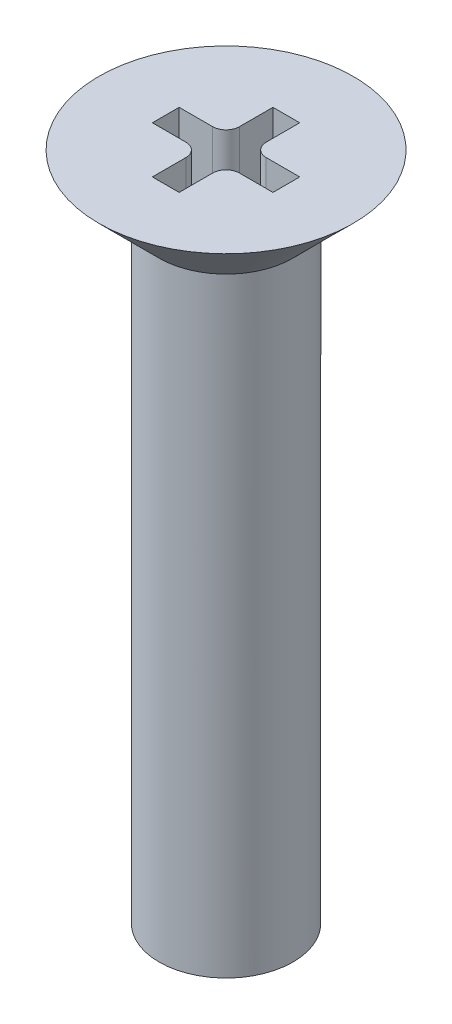
ISO-10303-21;
HEADER;
FILE_DESCRIPTION(('STEP AP214'),'2;1');
FILE_NAME('part.step','',(''),(''),'','','');
FILE_SCHEMA(('AUTOMOTIVE_DESIGN { 1 0 10303 214 1 1 1 1 }'));
ENDSEC;
DATA;
#1=APPLICATION_CONTEXT('core data for automotive mechanical design processes');
#2=APPLICATION_PROTOCOL_DEFINITION('international standard','automotive_design',2000,#1);
#3=PRODUCT_CONTEXT('',#1,'mechanical');
#4=PRODUCT('Part','Part','',(#3));
#5=PRODUCT_RELATED_PRODUCT_CATEGORY('part','',(#4));
#6=PRODUCT_DEFINITION_FORMATION('','',#4);
#7=PRODUCT_DEFINITION_CONTEXT('part definition',#1,'design');
#8=PRODUCT_DEFINITION('design','',#6,#7);
#9=PRODUCT_DEFINITION_SHAPE('','',#8);
#10=(LENGTH_UNIT() NAMED_UNIT(*) SI_UNIT(.MILLI.,.METRE.));
#11=(NAMED_UNIT(*) PLANE_ANGLE_UNIT() SI_UNIT($,.RADIAN.));
#12=(NAMED_UNIT(*) SI_UNIT($,.STERADIAN.) SOLID_ANGLE_UNIT());
#13=UNCERTAINTY_MEASURE_WITH_UNIT(LENGTH_MEASURE(1.E-05),#10,'distance_accuracy_value','');
#14=(GEOMETRIC_REPRESENTATION_CONTEXT(3) GLOBAL_UNCERTAINTY_ASSIGNED_CONTEXT((#13)) GLOBAL_UNIT_ASSIGNED_CONTEXT((#10,
#11,#12)) REPRESENTATION_CONTEXT('',''));
#15=CARTESIAN_POINT('',(0.,0.,0.));
#16=DIRECTION('',(0.,0.,1.));
#17=DIRECTION('',(1.,0.,0.));
#18=AXIS2_PLACEMENT_3D('',#15,#16,#17);
#19=CARTESIAN_POINT('',(0.,0.,0.));
#20=DIRECTION('',(0.,1.,0.));
#21=DIRECTION('',(0.,0.,1.));
#22=AXIS2_PLACEMENT_3D('',#19,#20,#21);
#23=PLANE('',#22);
#24=CARTESIAN_POINT('',(0.,0.,0.));
#25=DIRECTION('',(0.,1.,0.));
#26=DIRECTION('',(0.,0.,1.));
#27=AXIS2_PLACEMENT_3D('',#24,#25,#26);
#28=CIRCLE('',#27,1.9);
#29=CARTESIAN_POINT('',(0.,0.,1.9));
#30=VERTEX_POINT('',#29);
#31=EDGE_CURVE('E11',#30,#30,#28,.T.);
#32=ORIENTED_EDGE('',*,*,#31,.T.);
#33=EDGE_LOOP('',(#32));
#34=FACE_BOUND('',#33,.T.);
#35=DIRECTION('',(-1.,0.,0.));
#36=VECTOR('',#35,1.);
#37=CARTESIAN_POINT('',(0.4,0.,-0.2));
#38=LINE('',#37,#36);
#39=CARTESIAN_POINT('',(0.9,0.,-0.2));
#40=VERTEX_POINT('',#39);
#41=CARTESIAN_POINT('',(0.4,0.,-0.2));
#42=VERTEX_POINT('',#41);
#43=EDGE_CURVE('E47',#40,#42,#38,.T.);
#44=ORIENTED_EDGE('',*,*,#43,.F.);
#45=DIRECTION('',(0.,0.,-1.));
#46=VECTOR('',#45,1.);
#47=CARTESIAN_POINT('',(0.9,0.,0.2));
#48=LINE('',#47,#46);
#49=CARTESIAN_POINT('',(0.9,0.,0.2));
#50=VERTEX_POINT('',#49);
#51=EDGE_CURVE('E220',#50,#40,#48,.T.);
#52=ORIENTED_EDGE('',*,*,#51,.F.);
#53=DIRECTION('',(1.,0.,0.));
#54=VECTOR('',#53,1.);
#55=CARTESIAN_POINT('',(0.4,0.,0.2));
#56=LINE('',#55,#54);
#57=CARTESIAN_POINT('',(0.4,0.,0.2));
#58=VERTEX_POINT('',#57);
#59=EDGE_CURVE('E218',#58,#50,#56,.T.);
#60=ORIENTED_EDGE('',*,*,#59,.F.);
#61=CARTESIAN_POINT('',(0.4,0.,0.4));
#62=DIRECTION('',(0.,-1.,0.));
#63=DIRECTION('',(0.,0.,1.));
#64=AXIS2_PLACEMENT_3D('',#61,#62,#63);
#65=CIRCLE('',#64,0.2);
#66=CARTESIAN_POINT('',(0.2,0.,0.4));
#67=VERTEX_POINT('',#66);
#68=EDGE_CURVE('E155',#67,#58,#65,.T.);
#69=ORIENTED_EDGE('',*,*,#68,.F.);
#70=DIRECTION('',(0.,0.,-1.));
#71=VECTOR('',#70,1.);
#72=CARTESIAN_POINT('',(0.2,0.,0.9));
#73=LINE('',#72,#71);
#74=CARTESIAN_POINT('',(0.2,0.,0.9));
#75=VERTEX_POINT('',#74);
#76=EDGE_CURVE('E214',#75,#67,#73,.T.);
#77=ORIENTED_EDGE('',*,*,#76,.F.);
#78=DIRECTION('',(1.,0.,0.));
#79=VECTOR('',#78,1.);
#80=CARTESIAN_POINT('',(-0.2,0.,0.9));
#81=LINE('',#80,#79);
#82=CARTESIAN_POINT('',(-0.2,0.,0.9));
#83=VERTEX_POINT('',#82);
#84=EDGE_CURVE('E211',#83,#75,#81,.T.);
#85=ORIENTED_EDGE('',*,*,#84,.F.);
#86=DIRECTION('',(0.,0.,1.));
#87=VECTOR('',#86,1.);
#88=CARTESIAN_POINT('',(-0.2,0.,0.9));
#89=LINE('',#88,#87);
#90=CARTESIAN_POINT('',(-0.2,0.,0.4));
#91=VERTEX_POINT('',#90);
#92=EDGE_CURVE('E208',#91,#83,#89,.T.);
#93=ORIENTED_EDGE('',*,*,#92,.F.);
#94=CARTESIAN_POINT('',(-0.4,0.,0.4));
#95=DIRECTION('',(0.,-1.,0.));
#96=DIRECTION('',(0.,0.,1.));
#97=AXIS2_PLACEMENT_3D('',#94,#95,#96);
#98=CIRCLE('',#97,0.2);
#99=CARTESIAN_POINT('',(-0.4,0.,0.2));
#100=VERTEX_POINT('',#99);
#101=EDGE_CURVE('E205',#100,#91,#98,.T.);
#102=ORIENTED_EDGE('',*,*,#101,.F.);
#103=DIRECTION('',(1.,0.,0.));
#104=VECTOR('',#103,1.);
#105=CARTESIAN_POINT('',(-0.9,0.,0.2));
#106=LINE('',#105,#104);
#107=CARTESIAN_POINT('',(-0.9,0.,0.2));
#108=VERTEX_POINT('',#107);
#109=EDGE_CURVE('E202',#108,#100,#106,.T.);
#110=ORIENTED_EDGE('',*,*,#109,.F.);
#111=DIRECTION('',(0.,0.,1.));
#112=VECTOR('',#111,1.);
#113=CARTESIAN_POINT('',(-0.9,0.,0.2));
#114=LINE('',#113,#112);
#115=CARTESIAN_POINT('',(-0.9,0.,-0.2));
#116=VERTEX_POINT('',#115);
#117=EDGE_CURVE('E199',#116,#108,#114,.T.);
#118=ORIENTED_EDGE('',*,*,#117,.F.);
#119=DIRECTION('',(-1.,0.,0.));
#120=VECTOR('',#119,1.);
#121=CARTESIAN_POINT('',(-0.9,0.,-0.2));
#122=LINE('',#121,#120);
#123=CARTESIAN_POINT('',(-0.4,0.,-0.2));
#124=VERTEX_POINT('',#123);
#125=EDGE_CURVE('E196',#124,#116,#122,.T.);
#126=ORIENTED_EDGE('',*,*,#125,.F.);
#127=CARTESIAN_POINT('',(-0.4,0.,-0.4));
#128=DIRECTION('',(0.,-1.,0.));
#129=DIRECTION('',(0.,0.,1.));
#130=AXIS2_PLACEMENT_3D('',#127,#128,#129);
#131=CIRCLE('',#130,0.2);
#132=CARTESIAN_POINT('',(-0.2,0.,-0.4));
#133=VERTEX_POINT('',#132);
#134=EDGE_CURVE('E193',#133,#124,#131,.T.);
#135=ORIENTED_EDGE('',*,*,#134,.F.);
#136=DIRECTION('',(0.,0.,1.));
#137=VECTOR('',#136,1.);
#138=CARTESIAN_POINT('',(-0.2,0.,-0.4));
#139=LINE('',#138,#137);
#140=CARTESIAN_POINT('',(-0.2,0.,-0.9));
#141=VERTEX_POINT('',#140);
#142=EDGE_CURVE('E190',#141,#133,#139,.T.);
#143=ORIENTED_EDGE('',*,*,#142,.F.);
#144=DIRECTION('',(-1.,0.,0.));
#145=VECTOR('',#144,1.);
#146=CARTESIAN_POINT('',(-0.2,0.,-0.9));
#147=LINE('',#146,#145);
#148=CARTESIAN_POINT('',(0.2,0.,-0.9));
#149=VERTEX_POINT('',#148);
#150=EDGE_CURVE('E187',#149,#141,#147,.T.);
#151=ORIENTED_EDGE('',*,*,#150,.F.);
#152=DIRECTION('',(0.,0.,-1.));
#153=VECTOR('',#152,1.);
#154=CARTESIAN_POINT('',(0.2,0.,-0.4));
#155=LINE('',#154,#153);
#156=CARTESIAN_POINT('',(0.2,0.,-0.4));
#157=VERTEX_POINT('',#156);
#158=EDGE_CURVE('E184',#157,#149,#155,.T.);
#159=ORIENTED_EDGE('',*,*,#158,.F.);
#160=CARTESIAN_POINT('',(0.4,0.,-0.4));
#161=DIRECTION('',(0.,-1.,0.));
#162=DIRECTION('',(0.,0.,1.));
#163=AXIS2_PLACEMENT_3D('',#160,#161,#162);
#164=CIRCLE('',#163,0.2);
#165=EDGE_CURVE('E181',#42,#157,#164,.T.);
#166=ORIENTED_EDGE('',*,*,#165,.F.);
#167=EDGE_LOOP('',(#44,#52,#60,#69,#77,#85,#93,#102,#110,#118,#126,#135,#143,#151,#159,#166));
#168=FACE_BOUND('',#167,.T.);
#169=ADVANCED_FACE('F33',(#34,#168),#23,.T.);
#170=CARTESIAN_POINT('',(0.,0.,0.));
#171=DIRECTION('',(0.,1.,0.));
#172=DIRECTION('',(0.,0.,1.));
#173=AXIS2_PLACEMENT_3D('',#170,#171,#172);
#174=CONICAL_SURFACE('',#173,1.9,0.785398163397447);
#175=CARTESIAN_POINT('',(0.,-0.900000000000003,0.));
#176=DIRECTION('',(0.,1.,0.));
#177=DIRECTION('',(0.,0.,1.));
#178=AXIS2_PLACEMENT_3D('',#175,#176,#177);
#179=CIRCLE('',#178,1.);
#180=CARTESIAN_POINT('',(0.,-0.900000000000003,1.));
#181=VERTEX_POINT('',#180);
#182=EDGE_CURVE('E40',#181,#181,#179,.T.);
#183=ORIENTED_EDGE('',*,*,#182,.T.);
#184=EDGE_LOOP('',(#183));
#185=FACE_BOUND('',#184,.T.);
#186=ORIENTED_EDGE('',*,*,#31,.F.);
#187=EDGE_LOOP('',(#186));
#188=FACE_BOUND('',#187,.T.);
#189=ADVANCED_FACE('F254',(#185,#188),#174,.T.);
#190=CARTESIAN_POINT('',(0.,0.872326938896606,0.));
#191=DIRECTION('',(0.,1.,0.));
#192=DIRECTION('',(0.,0.,1.));
#193=AXIS2_PLACEMENT_3D('',#190,#191,#192);
#194=CYLINDRICAL_SURFACE('',#193,1.);
#195=ORIENTED_EDGE('',*,*,#182,.F.);
#196=EDGE_LOOP('',(#195));
#197=FACE_BOUND('',#196,.T.);
#198=CARTESIAN_POINT('',(0.,-10.,0.));
#199=DIRECTION('',(0.,-1.,0.));
#200=DIRECTION('',(0.,0.,-1.));
#201=AXIS2_PLACEMENT_3D('',#198,#199,#200);
#202=CIRCLE('',#201,1.);
#203=CARTESIAN_POINT('',(0.,-10.,-1.));
#204=VERTEX_POINT('',#203);
#205=EDGE_CURVE('E224',#204,#204,#202,.T.);
#206=ORIENTED_EDGE('',*,*,#205,.F.);
#207=EDGE_LOOP('',(#206));
#208=FACE_BOUND('',#207,.T.);
#209=ADVANCED_FACE('F257',(#197,#208),#194,.T.);
#210=CARTESIAN_POINT('',(0.,-10.,0.));
#211=DIRECTION('',(0.,-1.,0.));
#212=DIRECTION('',(0.,0.,-1.));
#213=AXIS2_PLACEMENT_3D('',#210,#211,#212);
#214=PLANE('',#213);
#215=ORIENTED_EDGE('',*,*,#205,.T.);
#216=EDGE_LOOP('',(#215));
#217=FACE_BOUND('',#216,.T.);
#218=ADVANCED_FACE('F260',(#217),#214,.T.);
#219=CARTESIAN_POINT('',(0.4,-1.,-0.2));
#220=DIRECTION('',(0.,0.,-1.));
#221=DIRECTION('',(-1.,0.,0.));
#222=AXIS2_PLACEMENT_3D('',#219,#220,#221);
#223=PLANE('',#222);
#224=ORIENTED_EDGE('',*,*,#43,.T.);
#225=DIRECTION('',(0.,1.,0.));
#226=VECTOR('',#225,1.);
#227=CARTESIAN_POINT('',(0.4,-1.,-0.2));
#228=LINE('',#227,#226);
#229=CARTESIAN_POINT('',(0.4,-1.,-0.2));
#230=VERTEX_POINT('',#229);
#231=EDGE_CURVE('E107',#230,#42,#228,.T.);
#232=ORIENTED_EDGE('',*,*,#231,.F.);
#233=DIRECTION('',(-1.,0.,0.));
#234=VECTOR('',#233,1.);
#235=CARTESIAN_POINT('',(0.4,-1.,-0.2));
#236=LINE('',#235,#234);
#237=CARTESIAN_POINT('',(0.9,-1.,-0.2));
#238=VERTEX_POINT('',#237);
#239=EDGE_CURVE('E222',#238,#230,#236,.T.);
#240=ORIENTED_EDGE('',*,*,#239,.F.);
#241=DIRECTION('',(0.,1.,0.));
#242=VECTOR('',#241,1.);
#243=CARTESIAN_POINT('',(0.9,-1.,-0.2));
#244=LINE('',#243,#242);
#245=EDGE_CURVE('E55',#238,#40,#244,.T.);
#246=ORIENTED_EDGE('',*,*,#245,.T.);
#247=EDGE_LOOP('',(#224,#232,#240,#246));
#248=FACE_BOUND('',#247,.T.);
#249=ADVANCED_FACE('F265',(#248),#223,.F.);
#250=CARTESIAN_POINT('',(0.9,-1.,0.2));
#251=DIRECTION('',(1.,0.,0.));
#252=DIRECTION('',(0.,0.,-1.));
#253=AXIS2_PLACEMENT_3D('',#250,#251,#252);
#254=PLANE('',#253);
#255=ORIENTED_EDGE('',*,*,#51,.T.);
#256=ORIENTED_EDGE('',*,*,#245,.F.);
#257=DIRECTION('',(0.,0.,-1.));
#258=VECTOR('',#257,1.);
#259=CARTESIAN_POINT('',(0.9,-1.,0.2));
#260=LINE('',#259,#258);
#261=CARTESIAN_POINT('',(0.9,-1.,0.2));
#262=VERTEX_POINT('',#261);
#263=EDGE_CURVE('E167',#262,#238,#260,.T.);
#264=ORIENTED_EDGE('',*,*,#263,.F.);
#265=DIRECTION('',(0.,1.,0.));
#266=VECTOR('',#265,1.);
#267=CARTESIAN_POINT('',(0.9,-1.,0.2));
#268=LINE('',#267,#266);
#269=EDGE_CURVE('E159',#262,#50,#268,.T.);
#270=ORIENTED_EDGE('',*,*,#269,.T.);
#271=EDGE_LOOP('',(#255,#256,#264,#270));
#272=FACE_BOUND('',#271,.T.);
#273=ADVANCED_FACE('F270',(#272),#254,.F.);
#274=CARTESIAN_POINT('',(0.4,-1.,0.2));
#275=DIRECTION('',(0.,0.,1.));
#276=DIRECTION('',(1.,0.,0.));
#277=AXIS2_PLACEMENT_3D('',#274,#275,#276);
#278=PLANE('',#277);
#279=ORIENTED_EDGE('',*,*,#59,.T.);
#280=ORIENTED_EDGE('',*,*,#269,.F.);
#281=DIRECTION('',(1.,0.,0.));
#282=VECTOR('',#281,1.);
#283=CARTESIAN_POINT('',(0.4,-1.,0.2));
#284=LINE('',#283,#282);
#285=CARTESIAN_POINT('',(0.4,-1.,0.2));
#286=VERTEX_POINT('',#285);
#287=EDGE_CURVE('E163',#286,#262,#284,.T.);
#288=ORIENTED_EDGE('',*,*,#287,.F.);
#289=DIRECTION('',(0.,1.,0.));
#290=VECTOR('',#289,1.);
#291=CARTESIAN_POINT('',(0.4,-1.,0.2));
#292=LINE('',#291,#290);
#293=EDGE_CURVE('E148',#286,#58,#292,.T.);
#294=ORIENTED_EDGE('',*,*,#293,.T.);
#295=EDGE_LOOP('',(#279,#280,#288,#294));
#296=FACE_BOUND('',#295,.T.);
#297=ADVANCED_FACE('F164',(#296),#278,.F.);
#298=CARTESIAN_POINT('',(0.4,-1.,0.4));
#299=DIRECTION('',(0.,1.,0.));
#300=DIRECTION('',(0.,0.,1.));
#301=AXIS2_PLACEMENT_3D('',#298,#299,#300);
#302=CYLINDRICAL_SURFACE('',#301,0.2);
#303=ORIENTED_EDGE('',*,*,#68,.T.);
#304=ORIENTED_EDGE('',*,*,#293,.F.);
#305=CARTESIAN_POINT('',(0.4,-1.,0.4));
#306=DIRECTION('',(0.,-1.,0.));
#307=DIRECTION('',(0.,0.,1.));
#308=AXIS2_PLACEMENT_3D('',#305,#306,#307);
#309=CIRCLE('',#308,0.2);
#310=CARTESIAN_POINT('',(0.2,-1.,0.4));
#311=VERTEX_POINT('',#310);
#312=EDGE_CURVE('E152',#311,#286,#309,.T.);
#313=ORIENTED_EDGE('',*,*,#312,.F.);
#314=DIRECTION('',(0.,1.,0.));
#315=VECTOR('',#314,1.);
#316=CARTESIAN_POINT('',(0.2,-1.,0.4));
#317=LINE('',#316,#315);
#318=EDGE_CURVE('E160',#311,#67,#317,.T.);
#319=ORIENTED_EDGE('',*,*,#318,.T.);
#320=EDGE_LOOP('',(#303,#304,#313,#319));
#321=FACE_BOUND('',#320,.T.);
#322=ADVANCED_FACE('F150',(#321),#302,.T.);
#323=CARTESIAN_POINT('',(0.2,-1.,0.9));
#324=DIRECTION('',(1.,0.,0.));
#325=DIRECTION('',(0.,0.,-1.));
#326=AXIS2_PLACEMENT_3D('',#323,#324,#325);
#327=PLANE('',#326);
#328=ORIENTED_EDGE('',*,*,#76,.T.);
#329=ORIENTED_EDGE('',*,*,#318,.F.);
#330=DIRECTION('',(0.,0.,-1.));
#331=VECTOR('',#330,1.);
#332=CARTESIAN_POINT('',(0.2,-1.,0.9));
#333=LINE('',#332,#331);
#334=CARTESIAN_POINT('',(0.2,-1.,0.9));
#335=VERTEX_POINT('',#334);
#336=EDGE_CURVE('E173',#335,#311,#333,.T.);
#337=ORIENTED_EDGE('',*,*,#336,.F.);
#338=DIRECTION('',(0.,1.,0.));
#339=VECTOR('',#338,1.);
#340=CARTESIAN_POINT('',(0.2,-1.,0.9));
#341=LINE('',#340,#339);
#342=EDGE_CURVE('E227',#335,#75,#341,.T.);
#343=ORIENTED_EDGE('',*,*,#342,.T.);
#344=EDGE_LOOP('',(#328,#329,#337,#343));
#345=FACE_BOUND('',#344,.T.);
#346=ADVANCED_FACE('F324',(#345),#327,.F.);
#347=CARTESIAN_POINT('',(-0.2,-1.,0.9));
#348=DIRECTION('',(0.,0.,1.));
#349=DIRECTION('',(1.,0.,0.));
#350=AXIS2_PLACEMENT_3D('',#347,#348,#349);
#351=PLANE('',#350);
#352=ORIENTED_EDGE('',*,*,#84,.T.);
#353=ORIENTED_EDGE('',*,*,#342,.F.);
#354=DIRECTION('',(1.,0.,0.));
#355=VECTOR('',#354,1.);
#356=CARTESIAN_POINT('',(-0.2,-1.,0.9));
#357=LINE('',#356,#355);
#358=CARTESIAN_POINT('',(-0.2,-1.,0.9));
#359=VERTEX_POINT('',#358);
#360=EDGE_CURVE('E175',#359,#335,#357,.T.);
#361=ORIENTED_EDGE('',*,*,#360,.F.);
#362=DIRECTION('',(0.,1.,0.));
#363=VECTOR('',#362,1.);
#364=CARTESIAN_POINT('',(-0.2,-1.,0.9));
#365=LINE('',#364,#363);
#366=EDGE_CURVE('E229',#359,#83,#365,.T.);
#367=ORIENTED_EDGE('',*,*,#366,.T.);
#368=EDGE_LOOP('',(#352,#353,#361,#367));
#369=FACE_BOUND('',#368,.T.);
#370=ADVANCED_FACE('F320',(#369),#351,.F.);
#371=CARTESIAN_POINT('',(-0.2,-1.,0.9));
#372=DIRECTION('',(-1.,0.,0.));
#373=DIRECTION('',(0.,0.,1.));
#374=AXIS2_PLACEMENT_3D('',#371,#372,#373);
#375=PLANE('',#374);
#376=ORIENTED_EDGE('',*,*,#92,.T.);
#377=ORIENTED_EDGE('',*,*,#366,.F.);
#378=DIRECTION('',(0.,0.,1.));
#379=VECTOR('',#378,1.);
#380=CARTESIAN_POINT('',(-0.2,-1.,0.9));
#381=LINE('',#380,#379);
#382=CARTESIAN_POINT('',(-0.2,-1.,0.4));
#383=VERTEX_POINT('',#382);
#384=EDGE_CURVE('E315',#383,#359,#381,.T.);
#385=ORIENTED_EDGE('',*,*,#384,.F.);
#386=DIRECTION('',(0.,1.,0.));
#387=VECTOR('',#386,1.);
#388=CARTESIAN_POINT('',(-0.2,-1.,0.4));
#389=LINE('',#388,#387);
#390=EDGE_CURVE('E231',#383,#91,#389,.T.);
#391=ORIENTED_EDGE('',*,*,#390,.T.);
#392=EDGE_LOOP('',(#376,#377,#385,#391));
#393=FACE_BOUND('',#392,.T.);
#394=ADVANCED_FACE('F329',(#393),#375,.F.);
#395=CARTESIAN_POINT('',(-0.4,-1.,0.4));
#396=DIRECTION('',(0.,1.,0.));
#397=DIRECTION('',(0.,0.,1.));
#398=AXIS2_PLACEMENT_3D('',#395,#396,#397);
#399=CYLINDRICAL_SURFACE('',#398,0.2);
#400=ORIENTED_EDGE('',*,*,#101,.T.);
#401=ORIENTED_EDGE('',*,*,#390,.F.);
#402=CARTESIAN_POINT('',(-0.4,-1.,0.4));
#403=DIRECTION('',(0.,-1.,0.));
#404=DIRECTION('',(0.,0.,1.));
#405=AXIS2_PLACEMENT_3D('',#402,#403,#404);
#406=CIRCLE('',#405,0.2);
#407=CARTESIAN_POINT('',(-0.4,-1.,0.2));
#408=VERTEX_POINT('',#407);
#409=EDGE_CURVE('E312',#408,#383,#406,.T.);
#410=ORIENTED_EDGE('',*,*,#409,.F.);
#411=DIRECTION('',(0.,1.,0.));
#412=VECTOR('',#411,1.);
#413=CARTESIAN_POINT('',(-0.4,-1.,0.2));
#414=LINE('',#413,#412);
#415=EDGE_CURVE('E233',#408,#100,#414,.T.);
#416=ORIENTED_EDGE('',*,*,#415,.T.);
#417=EDGE_LOOP('',(#400,#401,#410,#416));
#418=FACE_BOUND('',#417,.T.);
#419=ADVANCED_FACE('F332',(#418),#399,.T.);
#420=CARTESIAN_POINT('',(-0.9,-1.,0.2));
#421=DIRECTION('',(0.,0.,1.));
#422=DIRECTION('',(1.,0.,0.));
#423=AXIS2_PLACEMENT_3D('',#420,#421,#422);
#424=PLANE('',#423);
#425=ORIENTED_EDGE('',*,*,#109,.T.);
#426=ORIENTED_EDGE('',*,*,#415,.F.);
#427=DIRECTION('',(1.,0.,0.));
#428=VECTOR('',#427,1.);
#429=CARTESIAN_POINT('',(-0.9,-1.,0.2));
#430=LINE('',#429,#428);
#431=CARTESIAN_POINT('',(-0.9,-1.,0.2));
#432=VERTEX_POINT('',#431);
#433=EDGE_CURVE('E309',#432,#408,#430,.T.);
#434=ORIENTED_EDGE('',*,*,#433,.F.);
#435=DIRECTION('',(0.,1.,0.));
#436=VECTOR('',#435,1.);
#437=CARTESIAN_POINT('',(-0.9,-1.,0.2));
#438=LINE('',#437,#436);
#439=EDGE_CURVE('E235',#432,#108,#438,.T.);
#440=ORIENTED_EDGE('',*,*,#439,.T.);
#441=EDGE_LOOP('',(#425,#426,#434,#440));
#442=FACE_BOUND('',#441,.T.);
#443=ADVANCED_FACE('F335',(#442),#424,.F.);
#444=CARTESIAN_POINT('',(-0.9,-1.,0.2));
#445=DIRECTION('',(-1.,0.,0.));
#446=DIRECTION('',(0.,0.,1.));
#447=AXIS2_PLACEMENT_3D('',#444,#445,#446);
#448=PLANE('',#447);
#449=ORIENTED_EDGE('',*,*,#117,.T.);
#450=ORIENTED_EDGE('',*,*,#439,.F.);
#451=DIRECTION('',(0.,0.,1.));
#452=VECTOR('',#451,1.);
#453=CARTESIAN_POINT('',(-0.9,-1.,0.2));
#454=LINE('',#453,#452);
#455=CARTESIAN_POINT('',(-0.9,-1.,-0.2));
#456=VERTEX_POINT('',#455);
#457=EDGE_CURVE('E306',#456,#432,#454,.T.);
#458=ORIENTED_EDGE('',*,*,#457,.F.);
#459=DIRECTION('',(0.,1.,0.));
#460=VECTOR('',#459,1.);
#461=CARTESIAN_POINT('',(-0.9,-1.,-0.2));
#462=LINE('',#461,#460);
#463=EDGE_CURVE('E237',#456,#116,#462,.T.);
#464=ORIENTED_EDGE('',*,*,#463,.T.);
#465=EDGE_LOOP('',(#449,#450,#458,#464));
#466=FACE_BOUND('',#465,.T.);
#467=ADVANCED_FACE('F340',(#466),#448,.F.);
#468=CARTESIAN_POINT('',(-0.9,-1.,-0.2));
#469=DIRECTION('',(0.,0.,-1.));
#470=DIRECTION('',(-1.,0.,0.));
#471=AXIS2_PLACEMENT_3D('',#468,#469,#470);
#472=PLANE('',#471);
#473=ORIENTED_EDGE('',*,*,#125,.T.);
#474=ORIENTED_EDGE('',*,*,#463,.F.);
#475=DIRECTION('',(-1.,0.,0.));
#476=VECTOR('',#475,1.);
#477=CARTESIAN_POINT('',(-0.9,-1.,-0.2));
#478=LINE('',#477,#476);
#479=CARTESIAN_POINT('',(-0.4,-1.,-0.2));
#480=VERTEX_POINT('',#479);
#481=EDGE_CURVE('E303',#480,#456,#478,.T.);
#482=ORIENTED_EDGE('',*,*,#481,.F.);
#483=DIRECTION('',(0.,1.,0.));
#484=VECTOR('',#483,1.);
#485=CARTESIAN_POINT('',(-0.4,-1.,-0.2));
#486=LINE('',#485,#484);
#487=EDGE_CURVE('E239',#480,#124,#486,.T.);
#488=ORIENTED_EDGE('',*,*,#487,.T.);
#489=EDGE_LOOP('',(#473,#474,#482,#488));
#490=FACE_BOUND('',#489,.T.);
#491=ADVANCED_FACE('F344',(#490),#472,.F.);
#492=CARTESIAN_POINT('',(-0.4,-1.,-0.4));
#493=DIRECTION('',(0.,1.,0.));
#494=DIRECTION('',(0.,0.,1.));
#495=AXIS2_PLACEMENT_3D('',#492,#493,#494);
#496=CYLINDRICAL_SURFACE('',#495,0.2);
#497=ORIENTED_EDGE('',*,*,#134,.T.);
#498=ORIENTED_EDGE('',*,*,#487,.F.);
#499=CARTESIAN_POINT('',(-0.4,-1.,-0.4));
#500=DIRECTION('',(0.,-1.,0.));
#501=DIRECTION('',(0.,0.,1.));
#502=AXIS2_PLACEMENT_3D('',#499,#500,#501);
#503=CIRCLE('',#502,0.2);
#504=CARTESIAN_POINT('',(-0.2,-1.,-0.4));
#505=VERTEX_POINT('',#504);
#506=EDGE_CURVE('E300',#505,#480,#503,.T.);
#507=ORIENTED_EDGE('',*,*,#506,.F.);
#508=DIRECTION('',(0.,1.,0.));
#509=VECTOR('',#508,1.);
#510=CARTESIAN_POINT('',(-0.2,-1.,-0.4));
#511=LINE('',#510,#509);
#512=EDGE_CURVE('E241',#505,#133,#511,.T.);
#513=ORIENTED_EDGE('',*,*,#512,.T.);
#514=EDGE_LOOP('',(#497,#498,#507,#513));
#515=FACE_BOUND('',#514,.T.);
#516=ADVANCED_FACE('F347',(#515),#496,.T.);
#517=CARTESIAN_POINT('',(-0.2,-1.,-0.4));
#518=DIRECTION('',(-1.,0.,0.));
#519=DIRECTION('',(0.,0.,1.));
#520=AXIS2_PLACEMENT_3D('',#517,#518,#519);
#521=PLANE('',#520);
#522=ORIENTED_EDGE('',*,*,#142,.T.);
#523=ORIENTED_EDGE('',*,*,#512,.F.);
#524=DIRECTION('',(0.,0.,1.));
#525=VECTOR('',#524,1.);
#526=CARTESIAN_POINT('',(-0.2,-1.,-0.4));
#527=LINE('',#526,#525);
#528=CARTESIAN_POINT('',(-0.2,-1.,-0.9));
#529=VERTEX_POINT('',#528);
#530=EDGE_CURVE('E297',#529,#505,#527,.T.);
#531=ORIENTED_EDGE('',*,*,#530,.F.);
#532=DIRECTION('',(0.,1.,0.));
#533=VECTOR('',#532,1.);
#534=CARTESIAN_POINT('',(-0.2,-1.,-0.9));
#535=LINE('',#534,#533);
#536=EDGE_CURVE('E243',#529,#141,#535,.T.);
#537=ORIENTED_EDGE('',*,*,#536,.T.);
#538=EDGE_LOOP('',(#522,#523,#531,#537));
#539=FACE_BOUND('',#538,.T.);
#540=ADVANCED_FACE('F350',(#539),#521,.F.);
#541=CARTESIAN_POINT('',(-0.2,-1.,-0.9));
#542=DIRECTION('',(0.,0.,-1.));
#543=DIRECTION('',(-1.,0.,0.));
#544=AXIS2_PLACEMENT_3D('',#541,#542,#543);
#545=PLANE('',#544);
#546=ORIENTED_EDGE('',*,*,#150,.T.);
#547=ORIENTED_EDGE('',*,*,#536,.F.);
#548=DIRECTION('',(-1.,0.,0.));
#549=VECTOR('',#548,1.);
#550=CARTESIAN_POINT('',(-0.2,-1.,-0.9));
#551=LINE('',#550,#549);
#552=CARTESIAN_POINT('',(0.2,-1.,-0.9));
#553=VERTEX_POINT('',#552);
#554=EDGE_CURVE('E294',#553,#529,#551,.T.);
#555=ORIENTED_EDGE('',*,*,#554,.F.);
#556=DIRECTION('',(0.,1.,0.));
#557=VECTOR('',#556,1.);
#558=CARTESIAN_POINT('',(0.2,-1.,-0.9));
#559=LINE('',#558,#557);
#560=EDGE_CURVE('E245',#553,#149,#559,.T.);
#561=ORIENTED_EDGE('',*,*,#560,.T.);
#562=EDGE_LOOP('',(#546,#547,#555,#561));
#563=FACE_BOUND('',#562,.T.);
#564=ADVANCED_FACE('F354',(#563),#545,.F.);
#565=CARTESIAN_POINT('',(0.2,-1.,-0.4));
#566=DIRECTION('',(1.,0.,0.));
#567=DIRECTION('',(0.,0.,-1.));
#568=AXIS2_PLACEMENT_3D('',#565,#566,#567);
#569=PLANE('',#568);
#570=ORIENTED_EDGE('',*,*,#158,.T.);
#571=ORIENTED_EDGE('',*,*,#560,.F.);
#572=DIRECTION('',(0.,0.,-1.));
#573=VECTOR('',#572,1.);
#574=CARTESIAN_POINT('',(0.2,-1.,-0.4));
#575=LINE('',#574,#573);
#576=CARTESIAN_POINT('',(0.2,-1.,-0.4));
#577=VERTEX_POINT('',#576);
#578=EDGE_CURVE('E289',#577,#553,#575,.T.);
#579=ORIENTED_EDGE('',*,*,#578,.F.);
#580=DIRECTION('',(0.,1.,0.));
#581=VECTOR('',#580,1.);
#582=CARTESIAN_POINT('',(0.2,-1.,-0.4));
#583=LINE('',#582,#581);
#584=EDGE_CURVE('E247',#577,#157,#583,.T.);
#585=ORIENTED_EDGE('',*,*,#584,.T.);
#586=EDGE_LOOP('',(#570,#571,#579,#585));
#587=FACE_BOUND('',#586,.T.);
#588=ADVANCED_FACE('F356',(#587),#569,.F.);
#589=CARTESIAN_POINT('',(0.4,-1.,-0.4));
#590=DIRECTION('',(0.,1.,0.));
#591=DIRECTION('',(0.,0.,1.));
#592=AXIS2_PLACEMENT_3D('',#589,#590,#591);
#593=CYLINDRICAL_SURFACE('',#592,0.2);
#594=ORIENTED_EDGE('',*,*,#165,.T.);
#595=ORIENTED_EDGE('',*,*,#584,.F.);
#596=CARTESIAN_POINT('',(0.4,-1.,-0.4));
#597=DIRECTION('',(0.,-1.,0.));
#598=DIRECTION('',(0.,0.,1.));
#599=AXIS2_PLACEMENT_3D('',#596,#597,#598);
#600=CIRCLE('',#599,0.2);
#601=EDGE_CURVE('E287',#230,#577,#600,.T.);
#602=ORIENTED_EDGE('',*,*,#601,.F.);
#603=ORIENTED_EDGE('',*,*,#231,.T.);
#604=EDGE_LOOP('',(#594,#595,#602,#603));
#605=FACE_BOUND('',#604,.T.);
#606=ADVANCED_FACE('F284',(#605),#593,.T.);
#607=CARTESIAN_POINT('',(0.4,-1.,0.4));
#608=DIRECTION('',(0.,1.,0.));
#609=DIRECTION('',(0.,0.,1.));
#610=AXIS2_PLACEMENT_3D('',#607,#608,#609);
#611=PLANE('',#610);
#612=ORIENTED_EDGE('',*,*,#239,.T.);
#613=ORIENTED_EDGE('',*,*,#601,.T.);
#614=ORIENTED_EDGE('',*,*,#578,.T.);
#615=ORIENTED_EDGE('',*,*,#554,.T.);
#616=ORIENTED_EDGE('',*,*,#530,.T.);
#617=ORIENTED_EDGE('',*,*,#506,.T.);
#618=ORIENTED_EDGE('',*,*,#481,.T.);
#619=ORIENTED_EDGE('',*,*,#457,.T.);
#620=ORIENTED_EDGE('',*,*,#433,.T.);
#621=ORIENTED_EDGE('',*,*,#409,.T.);
#622=ORIENTED_EDGE('',*,*,#384,.T.);
#623=ORIENTED_EDGE('',*,*,#360,.T.);
#624=ORIENTED_EDGE('',*,*,#336,.T.);
#625=ORIENTED_EDGE('',*,*,#312,.T.);
#626=ORIENTED_EDGE('',*,*,#287,.T.);
#627=ORIENTED_EDGE('',*,*,#263,.T.);
#628=EDGE_LOOP('',(#612,#613,#614,#615,#616,#617,#618,#619,#620,#621,#622,#623,#624,#625,#626,#627));
#629=FACE_BOUND('',#628,.T.);
#630=ADVANCED_FACE('F170',(#629),#611,.T.);
#631=CLOSED_SHELL('',(#169,#189,#209,#218,#249,#273,#297,#322,#346,#370,#394,#419,#443,#467,
#491,#516,#540,#564,#588,#606,#630));
#632=MANIFOLD_SOLID_BREP('B2',#631);
#633=ADVANCED_BREP_SHAPE_REPRESENTATION('',(#18,#632),#14);
#634=SHAPE_DEFINITION_REPRESENTATION(#9,#633);
ENDSEC;
END-ISO-10303-21;
